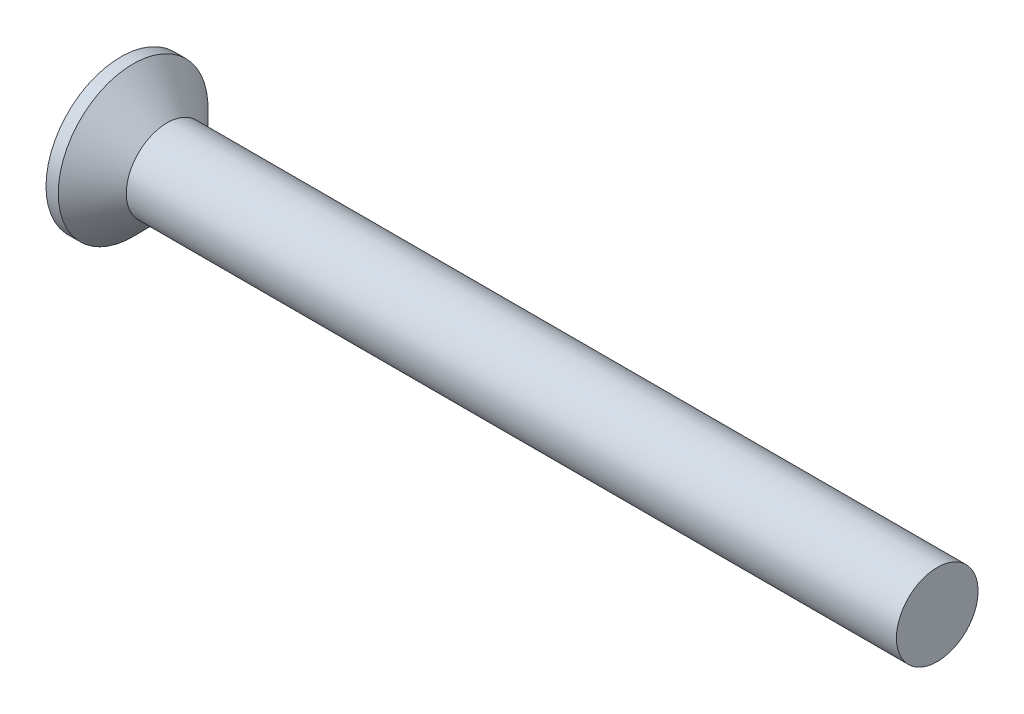
ISO-10303-21;
HEADER;
FILE_DESCRIPTION(('STEP AP214'),'2;1');
FILE_NAME('part.step','',(''),(''),'','','');
FILE_SCHEMA(('AUTOMOTIVE_DESIGN { 1 0 10303 214 1 1 1 1 }'));
ENDSEC;
DATA;
#1=APPLICATION_CONTEXT('core data for automotive mechanical design processes');
#2=APPLICATION_PROTOCOL_DEFINITION('international standard','automotive_design',2000,#1);
#3=PRODUCT_CONTEXT('',#1,'mechanical');
#4=PRODUCT('Part','Part','',(#3));
#5=PRODUCT_RELATED_PRODUCT_CATEGORY('part','',(#4));
#6=PRODUCT_DEFINITION_FORMATION('','',#4);
#7=PRODUCT_DEFINITION_CONTEXT('part definition',#1,'design');
#8=PRODUCT_DEFINITION('design','',#6,#7);
#9=PRODUCT_DEFINITION_SHAPE('','',#8);
#10=(LENGTH_UNIT() NAMED_UNIT(*) SI_UNIT(.MILLI.,.METRE.));
#11=(NAMED_UNIT(*) PLANE_ANGLE_UNIT() SI_UNIT($,.RADIAN.));
#12=(NAMED_UNIT(*) SI_UNIT($,.STERADIAN.) SOLID_ANGLE_UNIT());
#13=UNCERTAINTY_MEASURE_WITH_UNIT(LENGTH_MEASURE(1.E-05),#10,'distance_accuracy_value','');
#14=(GEOMETRIC_REPRESENTATION_CONTEXT(3) GLOBAL_UNCERTAINTY_ASSIGNED_CONTEXT((#13)) GLOBAL_UNIT_ASSIGNED_CONTEXT((#10,
#11,#12)) REPRESENTATION_CONTEXT('',''));
#15=CARTESIAN_POINT('',(0.,0.,0.));
#16=DIRECTION('',(0.,0.,1.));
#17=DIRECTION('',(1.,0.,0.));
#18=AXIS2_PLACEMENT_3D('',#15,#16,#17);
#19=CARTESIAN_POINT('',(0.,0.,0.));
#20=DIRECTION('',(-1.,0.,0.));
#21=DIRECTION('',(0.,0.,1.));
#22=AXIS2_PLACEMENT_3D('',#19,#20,#21);
#23=PLANE('',#22);
#24=CARTESIAN_POINT('',(0.,0.,0.));
#25=DIRECTION('',(-1.,0.,0.));
#26=DIRECTION('',(0.,0.,1.));
#27=AXIS2_PLACEMENT_3D('',#24,#25,#26);
#28=CIRCLE('',#27,2.75);
#29=CARTESIAN_POINT('',(0.,0.,2.75));
#30=VERTEX_POINT('',#29);
#31=EDGE_CURVE('E42',#30,#30,#28,.T.);
#32=ORIENTED_EDGE('',*,*,#31,.T.);
#33=EDGE_LOOP('',(#32));
#34=FACE_BOUND('',#33,.T.);
#35=DIRECTION('',(0.,1.,0.));
#36=VECTOR('',#35,1.);
#37=CARTESIAN_POINT('',(0.,-1.55,-0.395));
#38=LINE('',#37,#36);
#39=CARTESIAN_POINT('',(0.,-1.55,-0.395));
#40=VERTEX_POINT('',#39);
#41=CARTESIAN_POINT('',(0.,-0.394999999999999,-0.395));
#42=VERTEX_POINT('',#41);
#43=EDGE_CURVE('E103',#40,#42,#38,.T.);
#44=ORIENTED_EDGE('',*,*,#43,.T.);
#45=DIRECTION('',(0.,0.,-1.));
#46=VECTOR('',#45,1.);
#47=CARTESIAN_POINT('',(0.,-0.395000000000005,1.55));
#48=LINE('',#47,#46);
#49=CARTESIAN_POINT('',(0.,-0.394999999999995,-1.55));
#50=VERTEX_POINT('',#49);
#51=EDGE_CURVE('E83',#42,#50,#48,.T.);
#52=ORIENTED_EDGE('',*,*,#51,.T.);
#53=DIRECTION('',(0.,1.,0.));
#54=VECTOR('',#53,1.);
#55=CARTESIAN_POINT('',(0.,-0.394999999999995,-1.55));
#56=LINE('',#55,#54);
#57=CARTESIAN_POINT('',(0.,0.395000000000005,-1.55));
#58=VERTEX_POINT('',#57);
#59=EDGE_CURVE('E340',#50,#58,#56,.T.);
#60=ORIENTED_EDGE('',*,*,#59,.T.);
#61=DIRECTION('',(0.,0.,1.));
#62=VECTOR('',#61,1.);
#63=CARTESIAN_POINT('',(0.,0.395000000000005,-1.55));
#64=LINE('',#63,#62);
#65=CARTESIAN_POINT('',(0.,0.395000000000001,-0.395));
#66=VERTEX_POINT('',#65);
#67=EDGE_CURVE('E99',#58,#66,#64,.T.);
#68=ORIENTED_EDGE('',*,*,#67,.T.);
#69=CARTESIAN_POINT('',(0.,1.55,-0.395));
#70=VERTEX_POINT('',#69);
#71=EDGE_CURVE('E93',#66,#70,#38,.T.);
#72=ORIENTED_EDGE('',*,*,#71,.T.);
#73=DIRECTION('',(0.,0.,1.));
#74=VECTOR('',#73,1.);
#75=CARTESIAN_POINT('',(0.,1.55,-0.395));
#76=LINE('',#75,#74);
#77=CARTESIAN_POINT('',(0.,1.55,0.395));
#78=VERTEX_POINT('',#77);
#79=EDGE_CURVE('E96',#70,#78,#76,.T.);
#80=ORIENTED_EDGE('',*,*,#79,.T.);
#81=DIRECTION('',(0.,-1.,0.));
#82=VECTOR('',#81,1.);
#83=CARTESIAN_POINT('',(0.,1.55,0.395));
#84=LINE('',#83,#82);
#85=CARTESIAN_POINT('',(0.,0.394999999999998,0.395));
#86=VERTEX_POINT('',#85);
#87=EDGE_CURVE('E352',#78,#86,#84,.T.);
#88=ORIENTED_EDGE('',*,*,#87,.T.);
#89=CARTESIAN_POINT('',(0.,0.394999999999994,1.55));
#90=VERTEX_POINT('',#89);
#91=EDGE_CURVE('E335',#86,#90,#64,.T.);
#92=ORIENTED_EDGE('',*,*,#91,.T.);
#93=DIRECTION('',(0.,-1.,0.));
#94=VECTOR('',#93,1.);
#95=CARTESIAN_POINT('',(0.,0.394999999999994,1.55));
#96=LINE('',#95,#94);
#97=CARTESIAN_POINT('',(0.,-0.395000000000005,1.55));
#98=VERTEX_POINT('',#97);
#99=EDGE_CURVE('E321',#90,#98,#96,.T.);
#100=ORIENTED_EDGE('',*,*,#99,.T.);
#101=CARTESIAN_POINT('',(0.,-0.395000000000001,0.395));
#102=VERTEX_POINT('',#101);
#103=EDGE_CURVE('E333',#98,#102,#48,.T.);
#104=ORIENTED_EDGE('',*,*,#103,.T.);
#105=CARTESIAN_POINT('',(0.,-1.55,0.395));
#106=VERTEX_POINT('',#105);
#107=EDGE_CURVE('E109',#102,#106,#84,.T.);
#108=ORIENTED_EDGE('',*,*,#107,.T.);
#109=DIRECTION('',(0.,0.,-1.));
#110=VECTOR('',#109,1.);
#111=CARTESIAN_POINT('',(0.,-1.55,0.395));
#112=LINE('',#111,#110);
#113=EDGE_CURVE('E132',#106,#40,#112,.T.);
#114=ORIENTED_EDGE('',*,*,#113,.T.);
#115=EDGE_LOOP('',(#44,#52,#60,#68,#72,#80,#88,#92,#100,#104,#108,#114));
#116=FACE_BOUND('',#115,.T.);
#117=ADVANCED_FACE('F35',(#34,#116),#23,.T.);
#118=CARTESIAN_POINT('',(2.38373382624769,0.,0.16865988909427));
#119=DIRECTION('',(-0.0945267588569115,0.,-0.995522321125954));
#120=DIRECTION('',(-0.995522321125954,0.,0.0945267588569115));
#121=AXIS2_PLACEMENT_3D('',#118,#119,#120);
#122=PLANE('',#121);
#123=ORIENTED_EDGE('',*,*,#107,.F.);
#124=DIRECTION('',(0.991104257398676,0.0941072552097304,-0.0941072552097301));
#125=VECTOR('',#124,1.);
#126=CARTESIAN_POINT('',(2.39946475118715,-0.16716620751949,0.167166207519489));
#127=LINE('',#126,#125);
#128=CARTESIAN_POINT('',(2.08,-0.197500000000001,0.197499999999999));
#129=VERTEX_POINT('',#128);
#130=EDGE_CURVE('E127',#102,#129,#127,.T.);
#131=ORIENTED_EDGE('',*,*,#130,.T.);
#132=DIRECTION('',(0.835707904588477,0.543411029305728,-0.0793520726712617));
#133=VECTOR('',#132,1.);
#134=CARTESIAN_POINT('',(0.,-1.55,0.395));
#135=LINE('',#134,#133);
#136=EDGE_CURVE('E104',#106,#129,#135,.T.);
#137=ORIENTED_EDGE('',*,*,#136,.F.);
#138=EDGE_LOOP('',(#123,#131,#137));
#139=FACE_BOUND('',#138,.T.);
#140=ADVANCED_FACE('F155',(#139),#122,.T.);
#141=DIRECTION('',(0.835707904588477,-0.543411029305729,-0.0793520726712616));
#142=VECTOR('',#141,1.);
#143=CARTESIAN_POINT('',(0.,1.55,0.395));
#144=LINE('',#143,#142);
#145=CARTESIAN_POINT('',(2.08,0.1975,0.1975));
#146=VERTEX_POINT('',#145);
#147=EDGE_CURVE('E49',#78,#146,#144,.T.);
#148=ORIENTED_EDGE('',*,*,#147,.T.);
#149=DIRECTION('',(-0.991104257398676,0.0941072552097297,0.09410725520973));
#150=VECTOR('',#149,1.);
#151=CARTESIAN_POINT('',(2.39946475118715,0.167166207519489,0.167166207519489));
#152=LINE('',#151,#150);
#153=EDGE_CURVE('E348',#146,#86,#152,.T.);
#154=ORIENTED_EDGE('',*,*,#153,.T.);
#155=ORIENTED_EDGE('',*,*,#87,.F.);
#156=EDGE_LOOP('',(#148,#154,#155));
#157=FACE_BOUND('',#156,.T.);
#158=ADVANCED_FACE('F159',(#157),#122,.T.);
#159=CARTESIAN_POINT('',(2.38373382624769,0.,-0.16865988909427));
#160=DIRECTION('',(-0.0945267588569114,0.,0.995522321125954));
#161=DIRECTION('',(0.995522321125954,0.,0.0945267588569114));
#162=AXIS2_PLACEMENT_3D('',#159,#160,#161);
#163=PLANE('',#162);
#164=DIRECTION('',(0.835707904588477,0.543411029305729,0.0793520726712616));
#165=VECTOR('',#164,1.);
#166=CARTESIAN_POINT('',(0.,-1.55,-0.395));
#167=LINE('',#166,#165);
#168=CARTESIAN_POINT('',(2.08,-0.197499999999999,-0.197500000000001));
#169=VERTEX_POINT('',#168);
#170=EDGE_CURVE('E58',#40,#169,#167,.T.);
#171=ORIENTED_EDGE('',*,*,#170,.T.);
#172=DIRECTION('',(-0.991104257398676,-0.0941072552097297,-0.09410725520973));
#173=VECTOR('',#172,1.);
#174=CARTESIAN_POINT('',(2.39946475118715,-0.167166207519489,-0.167166207519489));
#175=LINE('',#174,#173);
#176=EDGE_CURVE('E11',#169,#42,#175,.T.);
#177=ORIENTED_EDGE('',*,*,#176,.T.);
#178=ORIENTED_EDGE('',*,*,#43,.F.);
#179=EDGE_LOOP('',(#171,#177,#178));
#180=FACE_BOUND('',#179,.T.);
#181=ADVANCED_FACE('F152',(#180),#163,.T.);
#182=ORIENTED_EDGE('',*,*,#71,.F.);
#183=DIRECTION('',(0.991104257398676,-0.0941072552097303,0.09410725520973));
#184=VECTOR('',#183,1.);
#185=CARTESIAN_POINT('',(2.39946475118715,0.16716620751949,-0.167166207519489));
#186=LINE('',#185,#184);
#187=CARTESIAN_POINT('',(2.08,0.1975,-0.1975));
#188=VERTEX_POINT('',#187);
#189=EDGE_CURVE('E112',#66,#188,#186,.T.);
#190=ORIENTED_EDGE('',*,*,#189,.T.);
#191=DIRECTION('',(0.835707904588477,-0.543411029305729,0.0793520726712616));
#192=VECTOR('',#191,1.);
#193=CARTESIAN_POINT('',(0.,1.55,-0.395));
#194=LINE('',#193,#192);
#195=EDGE_CURVE('E108',#70,#188,#194,.T.);
#196=ORIENTED_EDGE('',*,*,#195,.F.);
#197=EDGE_LOOP('',(#182,#190,#196));
#198=FACE_BOUND('',#197,.T.);
#199=ADVANCED_FACE('F111',(#198),#163,.T.);
#200=CARTESIAN_POINT('',(-6.34999999999999,0.,0.));
#201=DIRECTION('',(-1.,0.,0.));
#202=DIRECTION('',(0.,0.,1.));
#203=AXIS2_PLACEMENT_3D('',#200,#201,#202);
#204=CYLINDRICAL_SURFACE('',#203,2.75);
#205=CARTESIAN_POINT('',(0.450000000000004,0.,0.));
#206=DIRECTION('',(-1.,0.,0.));
#207=DIRECTION('',(0.,0.,1.));
#208=AXIS2_PLACEMENT_3D('',#205,#206,#207);
#209=CIRCLE('',#208,2.75);
#210=CARTESIAN_POINT('',(0.450000000000004,0.,2.75));
#211=VERTEX_POINT('',#210);
#212=EDGE_CURVE('E135',#211,#211,#209,.T.);
#213=ORIENTED_EDGE('',*,*,#212,.T.);
#214=EDGE_LOOP('',(#213));
#215=FACE_BOUND('',#214,.T.);
#216=ORIENTED_EDGE('',*,*,#31,.F.);
#217=EDGE_LOOP('',(#216));
#218=FACE_BOUND('',#217,.T.);
#219=ADVANCED_FACE('F141',(#215,#218),#204,.T.);
#220=CARTESIAN_POINT('',(0.450000000000004,0.,0.));
#221=DIRECTION('',(-1.,0.,0.));
#222=DIRECTION('',(0.,0.,1.));
#223=AXIS2_PLACEMENT_3D('',#220,#221,#222);
#224=CONICAL_SURFACE('',#223,2.75,0.78539816339745);
#225=CARTESIAN_POINT('',(1.7,0.,0.));
#226=DIRECTION('',(-1.,0.,0.));
#227=DIRECTION('',(0.,0.,1.));
#228=AXIS2_PLACEMENT_3D('',#225,#226,#227);
#229=CIRCLE('',#228,1.5);
#230=CARTESIAN_POINT('',(1.7,0.,1.5));
#231=VERTEX_POINT('',#230);
#232=EDGE_CURVE('E131',#231,#231,#229,.T.);
#233=ORIENTED_EDGE('',*,*,#232,.T.);
#234=EDGE_LOOP('',(#233));
#235=FACE_BOUND('',#234,.T.);
#236=ORIENTED_EDGE('',*,*,#212,.F.);
#237=EDGE_LOOP('',(#236));
#238=FACE_BOUND('',#237,.T.);
#239=ADVANCED_FACE('F143',(#235,#238),#224,.T.);
#240=CARTESIAN_POINT('',(-6.34999999999999,0.,0.));
#241=DIRECTION('',(-1.,0.,0.));
#242=DIRECTION('',(0.,0.,1.));
#243=AXIS2_PLACEMENT_3D('',#240,#241,#242);
#244=CYLINDRICAL_SURFACE('',#243,1.5);
#245=CARTESIAN_POINT('',(30.,0.,0.));
#246=DIRECTION('',(-1.,0.,0.));
#247=DIRECTION('',(0.,0.,1.));
#248=AXIS2_PLACEMENT_3D('',#245,#246,#247);
#249=CIRCLE('',#248,1.5);
#250=CARTESIAN_POINT('',(30.,0.,1.5));
#251=VERTEX_POINT('',#250);
#252=EDGE_CURVE('E128',#251,#251,#249,.T.);
#253=ORIENTED_EDGE('',*,*,#252,.T.);
#254=EDGE_LOOP('',(#253));
#255=FACE_BOUND('',#254,.T.);
#256=ORIENTED_EDGE('',*,*,#232,.F.);
#257=EDGE_LOOP('',(#256));
#258=FACE_BOUND('',#257,.T.);
#259=ADVANCED_FACE('F149',(#255,#258),#244,.T.);
#260=CARTESIAN_POINT('',(30.,1.5,0.));
#261=DIRECTION('',(1.,0.,0.));
#262=DIRECTION('',(0.,0.,-1.));
#263=AXIS2_PLACEMENT_3D('',#260,#261,#262);
#264=PLANE('',#263);
#265=ORIENTED_EDGE('',*,*,#252,.F.);
#266=EDGE_LOOP('',(#265));
#267=FACE_BOUND('',#266,.T.);
#268=ADVANCED_FACE('F179',(#267),#264,.T.);
#269=CARTESIAN_POINT('',(2.08,0.1975,-0.1975));
#270=DIRECTION('',(1.,0.,0.));
#271=DIRECTION('',(0.,0.,-1.));
#272=AXIS2_PLACEMENT_3D('',#269,#270,#271);
#273=PLANE('',#272);
#274=DIRECTION('',(0.,1.,0.));
#275=VECTOR('',#274,1.);
#276=CARTESIAN_POINT('',(2.08,-0.1975,-0.1975));
#277=LINE('',#276,#275);
#278=EDGE_CURVE('E123',#169,#188,#277,.T.);
#279=ORIENTED_EDGE('',*,*,#278,.F.);
#280=DIRECTION('',(0.,0.,-1.));
#281=VECTOR('',#280,1.);
#282=CARTESIAN_POINT('',(2.08,-0.1975,0.1975));
#283=LINE('',#282,#281);
#284=EDGE_CURVE('E114',#129,#169,#283,.T.);
#285=ORIENTED_EDGE('',*,*,#284,.F.);
#286=DIRECTION('',(0.,-1.,0.));
#287=VECTOR('',#286,1.);
#288=CARTESIAN_POINT('',(2.08,0.1975,0.1975));
#289=LINE('',#288,#287);
#290=EDGE_CURVE('E117',#146,#129,#289,.T.);
#291=ORIENTED_EDGE('',*,*,#290,.F.);
#292=DIRECTION('',(0.,0.,1.));
#293=VECTOR('',#292,1.);
#294=CARTESIAN_POINT('',(2.08,0.1975,-0.1975));
#295=LINE('',#294,#293);
#296=EDGE_CURVE('E121',#188,#146,#295,.T.);
#297=ORIENTED_EDGE('',*,*,#296,.F.);
#298=EDGE_LOOP('',(#279,#285,#291,#297));
#299=FACE_BOUND('',#298,.T.);
#300=ADVANCED_FACE('F176',(#299),#273,.F.);
#301=CARTESIAN_POINT('',(0.,-1.55,-0.395));
#302=DIRECTION('',(-0.54513001368185,0.838351518268576,0.));
#303=DIRECTION('',(-0.838351518268576,-0.54513001368185,0.));
#304=AXIS2_PLACEMENT_3D('',#301,#302,#303);
#305=PLANE('',#304);
#306=ORIENTED_EDGE('',*,*,#170,.F.);
#307=ORIENTED_EDGE('',*,*,#113,.F.);
#308=ORIENTED_EDGE('',*,*,#136,.T.);
#309=ORIENTED_EDGE('',*,*,#284,.T.);
#310=EDGE_LOOP('',(#306,#307,#308,#309));
#311=FACE_BOUND('',#310,.T.);
#312=ADVANCED_FACE('F168',(#311),#305,.T.);
#313=CARTESIAN_POINT('',(0.,1.55,0.395));
#314=DIRECTION('',(-0.54513001368185,-0.838351518268576,0.));
#315=DIRECTION('',(0.838351518268576,-0.54513001368185,0.));
#316=AXIS2_PLACEMENT_3D('',#313,#314,#315);
#317=PLANE('',#316);
#318=ORIENTED_EDGE('',*,*,#147,.F.);
#319=ORIENTED_EDGE('',*,*,#79,.F.);
#320=ORIENTED_EDGE('',*,*,#195,.T.);
#321=ORIENTED_EDGE('',*,*,#296,.T.);
#322=EDGE_LOOP('',(#318,#319,#320,#321));
#323=FACE_BOUND('',#322,.T.);
#324=ADVANCED_FACE('F107',(#323),#317,.T.);
#325=CARTESIAN_POINT('',(2.38373382624769,-0.16865988909427,0.));
#326=DIRECTION('',(-0.0945267588569115,0.995522321125954,0.));
#327=DIRECTION('',(-0.995522321125954,-0.0945267588569115,0.));
#328=AXIS2_PLACEMENT_3D('',#325,#326,#327);
#329=PLANE('',#328);
#330=DIRECTION('',(0.835707904588477,0.0793520726712598,0.543411029305729));
#331=VECTOR('',#330,1.);
#332=CARTESIAN_POINT('',(0.,-0.394999999999995,-1.55));
#333=LINE('',#332,#331);
#334=EDGE_CURVE('E342',#50,#169,#333,.T.);
#335=ORIENTED_EDGE('',*,*,#334,.F.);
#336=ORIENTED_EDGE('',*,*,#51,.F.);
#337=ORIENTED_EDGE('',*,*,#176,.F.);
#338=EDGE_LOOP('',(#335,#336,#337));
#339=FACE_BOUND('',#338,.T.);
#340=ADVANCED_FACE('F175',(#339),#329,.T.);
#341=CARTESIAN_POINT('',(2.38373382624769,0.16865988909427,0.));
#342=DIRECTION('',(-0.0945267588569114,-0.995522321125954,0.));
#343=DIRECTION('',(0.995522321125954,-0.0945267588569114,0.));
#344=AXIS2_PLACEMENT_3D('',#341,#342,#343);
#345=PLANE('',#344);
#346=ORIENTED_EDGE('',*,*,#67,.F.);
#347=DIRECTION('',(0.835707904588477,-0.0793520726712635,0.543411029305728));
#348=VECTOR('',#347,1.);
#349=CARTESIAN_POINT('',(0.,0.395000000000005,-1.55));
#350=LINE('',#349,#348);
#351=EDGE_CURVE('E74',#58,#188,#350,.T.);
#352=ORIENTED_EDGE('',*,*,#351,.T.);
#353=ORIENTED_EDGE('',*,*,#189,.F.);
#354=EDGE_LOOP('',(#346,#352,#353));
#355=FACE_BOUND('',#354,.T.);
#356=ADVANCED_FACE('F219',(#355),#345,.T.);
#357=CARTESIAN_POINT('',(0.,0.395000000000005,-1.55));
#358=DIRECTION('',(-0.54513001368185,0.,0.838351518268576));
#359=DIRECTION('',(-0.838351518268576,0.,-0.54513001368185));
#360=AXIS2_PLACEMENT_3D('',#357,#358,#359);
#361=PLANE('',#360);
#362=ORIENTED_EDGE('',*,*,#351,.F.);
#363=ORIENTED_EDGE('',*,*,#59,.F.);
#364=ORIENTED_EDGE('',*,*,#334,.T.);
#365=ORIENTED_EDGE('',*,*,#278,.T.);
#366=EDGE_LOOP('',(#362,#363,#364,#365));
#367=FACE_BOUND('',#366,.T.);
#368=ADVANCED_FACE('F227',(#367),#361,.T.);
#369=ORIENTED_EDGE('',*,*,#103,.F.);
#370=DIRECTION('',(0.835707904588477,0.0793520726712635,-0.543411029305728));
#371=VECTOR('',#370,1.);
#372=CARTESIAN_POINT('',(0.,-0.395000000000005,1.55));
#373=LINE('',#372,#371);
#374=EDGE_CURVE('E318',#98,#129,#373,.T.);
#375=ORIENTED_EDGE('',*,*,#374,.T.);
#376=ORIENTED_EDGE('',*,*,#130,.F.);
#377=EDGE_LOOP('',(#369,#375,#376));
#378=FACE_BOUND('',#377,.T.);
#379=ADVANCED_FACE('F221',(#378),#329,.T.);
#380=DIRECTION('',(0.835707904588477,-0.0793520726712597,-0.543411029305729));
#381=VECTOR('',#380,1.);
#382=CARTESIAN_POINT('',(0.,0.394999999999994,1.55));
#383=LINE('',#382,#381);
#384=EDGE_CURVE('E329',#90,#146,#383,.T.);
#385=ORIENTED_EDGE('',*,*,#384,.F.);
#386=ORIENTED_EDGE('',*,*,#91,.F.);
#387=ORIENTED_EDGE('',*,*,#153,.F.);
#388=EDGE_LOOP('',(#385,#386,#387));
#389=FACE_BOUND('',#388,.T.);
#390=ADVANCED_FACE('F229',(#389),#345,.T.);
#391=CARTESIAN_POINT('',(0.,-0.395000000000005,1.55));
#392=DIRECTION('',(-0.54513001368185,0.,-0.838351518268576));
#393=DIRECTION('',(0.838351518268576,0.,-0.54513001368185));
#394=AXIS2_PLACEMENT_3D('',#391,#392,#393);
#395=PLANE('',#394);
#396=ORIENTED_EDGE('',*,*,#374,.F.);
#397=ORIENTED_EDGE('',*,*,#99,.F.);
#398=ORIENTED_EDGE('',*,*,#384,.T.);
#399=ORIENTED_EDGE('',*,*,#290,.T.);
#400=EDGE_LOOP('',(#396,#397,#398,#399));
#401=FACE_BOUND('',#400,.T.);
#402=ADVANCED_FACE('F248',(#401),#395,.T.);
#403=CLOSED_SHELL('',(#117,#140,#158,#181,#199,#219,#239,#259,#268,#300,#312,#324,#340,#356,
#368,#379,#390,#402));
#404=MANIFOLD_SOLID_BREP('B2',#403);
#405=ADVANCED_BREP_SHAPE_REPRESENTATION('',(#18,#404),#14);
#406=SHAPE_DEFINITION_REPRESENTATION(#9,#405);
ENDSEC;
END-ISO-10303-21;
